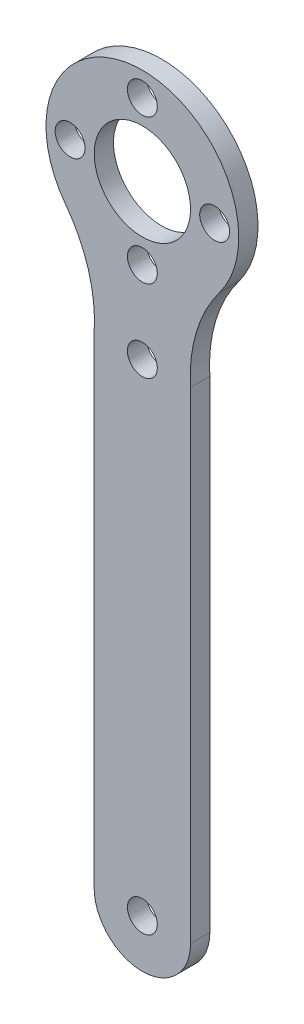
ISO-10303-21;
HEADER;
FILE_DESCRIPTION(('STEP AP214'),'2;1');
FILE_NAME('part.step','',(''),(''),'','','');
FILE_SCHEMA(('AUTOMOTIVE_DESIGN { 1 0 10303 214 1 1 1 1 }'));
ENDSEC;
DATA;
#1=APPLICATION_CONTEXT('core data for automotive mechanical design processes');
#2=APPLICATION_PROTOCOL_DEFINITION('international standard','automotive_design',2000,#1);
#3=PRODUCT_CONTEXT('',#1,'mechanical');
#4=PRODUCT('Part','Part','',(#3));
#5=PRODUCT_RELATED_PRODUCT_CATEGORY('part','',(#4));
#6=PRODUCT_DEFINITION_FORMATION('','',#4);
#7=PRODUCT_DEFINITION_CONTEXT('part definition',#1,'design');
#8=PRODUCT_DEFINITION('design','',#6,#7);
#9=PRODUCT_DEFINITION_SHAPE('','',#8);
#10=(LENGTH_UNIT() NAMED_UNIT(*) SI_UNIT(.MILLI.,.METRE.));
#11=(NAMED_UNIT(*) PLANE_ANGLE_UNIT() SI_UNIT($,.RADIAN.));
#12=(NAMED_UNIT(*) SI_UNIT($,.STERADIAN.) SOLID_ANGLE_UNIT());
#13=UNCERTAINTY_MEASURE_WITH_UNIT(LENGTH_MEASURE(1.E-05),#10,'distance_accuracy_value','');
#14=(GEOMETRIC_REPRESENTATION_CONTEXT(3) GLOBAL_UNCERTAINTY_ASSIGNED_CONTEXT((#13)) GLOBAL_UNIT_ASSIGNED_CONTEXT((#10,
#11,#12)) REPRESENTATION_CONTEXT('',''));
#15=CARTESIAN_POINT('',(0.,0.,0.));
#16=DIRECTION('',(0.,0.,1.));
#17=DIRECTION('',(1.,0.,0.));
#18=AXIS2_PLACEMENT_3D('',#15,#16,#17);
#19=CARTESIAN_POINT('',(0.,41.,2.));
#20=DIRECTION('',(0.,0.,-1.));
#21=DIRECTION('',(-1.,0.,0.));
#22=AXIS2_PLACEMENT_3D('',#19,#20,#21);
#23=CYLINDRICAL_SURFACE('',#22,10.);
#24=CARTESIAN_POINT('',(0.,41.,0.));
#25=DIRECTION('',(0.,0.,1.));
#26=DIRECTION('',(1.,0.,0.));
#27=AXIS2_PLACEMENT_3D('',#24,#25,#26);
#28=CIRCLE('',#27,10.);
#29=CARTESIAN_POINT('',(7.98772100593223,34.9836628143538,0.));
#30=VERTEX_POINT('',#29);
#31=CARTESIAN_POINT('',(-7.98772100593224,34.9836628143538,0.));
#32=VERTEX_POINT('',#31);
#33=EDGE_CURVE('E158',#30,#32,#28,.T.);
#34=ORIENTED_EDGE('',*,*,#33,.T.);
#35=DIRECTION('',(0.,0.,-1.));
#36=VECTOR('',#35,1.);
#37=CARTESIAN_POINT('',(-7.98772100593224,34.9836628143538,2.));
#38=LINE('',#37,#36);
#39=CARTESIAN_POINT('',(-7.98772100593224,34.9836628143538,2.));
#40=VERTEX_POINT('',#39);
#41=EDGE_CURVE('E11',#40,#32,#38,.T.);
#42=ORIENTED_EDGE('',*,*,#41,.F.);
#43=CARTESIAN_POINT('',(0.,41.,2.));
#44=DIRECTION('',(0.,0.,1.));
#45=DIRECTION('',(1.,0.,0.));
#46=AXIS2_PLACEMENT_3D('',#43,#44,#45);
#47=CIRCLE('',#46,10.);
#48=CARTESIAN_POINT('',(7.98772100593223,34.9836628143538,2.));
#49=VERTEX_POINT('',#48);
#50=EDGE_CURVE('E93',#49,#40,#47,.T.);
#51=ORIENTED_EDGE('',*,*,#50,.F.);
#52=DIRECTION('',(0.,0.,-1.));
#53=VECTOR('',#52,1.);
#54=CARTESIAN_POINT('',(7.98772100593223,34.9836628143538,2.));
#55=LINE('',#54,#53);
#56=EDGE_CURVE('E137',#49,#30,#55,.T.);
#57=ORIENTED_EDGE('',*,*,#56,.T.);
#58=EDGE_LOOP('',(#34,#42,#51,#57));
#59=FACE_BOUND('',#58,.T.);
#60=ADVANCED_FACE('F41',(#59),#23,.T.);
#61=CARTESIAN_POINT('',(-19.9693025148306,25.9591570358846,2.));
#62=DIRECTION('',(0.,0.,-1.));
#63=DIRECTION('',(-1.,0.,0.));
#64=AXIS2_PLACEMENT_3D('',#61,#62,#63);
#65=CYLINDRICAL_SURFACE('',#64,15.);
#66=CARTESIAN_POINT('',(-19.9693025148306,25.9591570358846,0.));
#67=DIRECTION('',(0.,0.,1.));
#68=DIRECTION('',(1.,0.,0.));
#69=AXIS2_PLACEMENT_3D('',#66,#67,#68);
#70=CIRCLE('',#69,15.);
#71=CARTESIAN_POINT('',(-5.00000000000001,25.,0.));
#72=VERTEX_POINT('',#71);
#73=EDGE_CURVE('E162',#72,#32,#70,.T.);
#74=ORIENTED_EDGE('',*,*,#73,.F.);
#75=DIRECTION('',(0.,0.,-1.));
#76=VECTOR('',#75,1.);
#77=CARTESIAN_POINT('',(-5.00000000000001,25.,2.));
#78=LINE('',#77,#76);
#79=CARTESIAN_POINT('',(-5.00000000000001,25.,2.));
#80=VERTEX_POINT('',#79);
#81=EDGE_CURVE('E51',#80,#72,#78,.T.);
#82=ORIENTED_EDGE('',*,*,#81,.F.);
#83=CARTESIAN_POINT('',(-19.9693025148306,25.9591570358846,2.));
#84=DIRECTION('',(0.,0.,1.));
#85=DIRECTION('',(1.,0.,0.));
#86=AXIS2_PLACEMENT_3D('',#83,#84,#85);
#87=CIRCLE('',#86,15.);
#88=EDGE_CURVE('E396',#80,#40,#87,.T.);
#89=ORIENTED_EDGE('',*,*,#88,.T.);
#90=ORIENTED_EDGE('',*,*,#41,.T.);
#91=EDGE_LOOP('',(#74,#82,#89,#90));
#92=FACE_BOUND('',#91,.T.);
#93=ADVANCED_FACE('F197',(#92),#65,.F.);
#94=CARTESIAN_POINT('',(-5.,0.,2.));
#95=DIRECTION('',(-1.,0.,0.));
#96=DIRECTION('',(0.,-1.,0.));
#97=AXIS2_PLACEMENT_3D('',#94,#95,#96);
#98=PLANE('',#97);
#99=DIRECTION('',(0.,1.,0.));
#100=VECTOR('',#99,1.);
#101=CARTESIAN_POINT('',(-5.,0.,0.));
#102=LINE('',#101,#100);
#103=CARTESIAN_POINT('',(-5.,-25.,0.));
#104=VERTEX_POINT('',#103);
#105=EDGE_CURVE('E166',#104,#72,#102,.T.);
#106=ORIENTED_EDGE('',*,*,#105,.F.);
#107=DIRECTION('',(0.,0.,-1.));
#108=VECTOR('',#107,1.);
#109=CARTESIAN_POINT('',(-5.,-25.,2.));
#110=LINE('',#109,#108);
#111=CARTESIAN_POINT('',(-5.,-25.,2.));
#112=VERTEX_POINT('',#111);
#113=EDGE_CURVE('E119',#112,#104,#110,.T.);
#114=ORIENTED_EDGE('',*,*,#113,.F.);
#115=DIRECTION('',(0.,1.,0.));
#116=VECTOR('',#115,1.);
#117=CARTESIAN_POINT('',(-5.,0.,2.));
#118=LINE('',#117,#116);
#119=EDGE_CURVE('E110',#112,#80,#118,.T.);
#120=ORIENTED_EDGE('',*,*,#119,.T.);
#121=ORIENTED_EDGE('',*,*,#81,.T.);
#122=EDGE_LOOP('',(#106,#114,#120,#121));
#123=FACE_BOUND('',#122,.T.);
#124=ADVANCED_FACE('F194',(#123),#98,.T.);
#125=CARTESIAN_POINT('',(0.,-25.,2.));
#126=DIRECTION('',(0.,0.,-1.));
#127=DIRECTION('',(-1.,0.,0.));
#128=AXIS2_PLACEMENT_3D('',#125,#126,#127);
#129=CYLINDRICAL_SURFACE('',#128,5.);
#130=CARTESIAN_POINT('',(0.,-25.,0.));
#131=DIRECTION('',(0.,0.,1.));
#132=DIRECTION('',(1.,0.,0.));
#133=AXIS2_PLACEMENT_3D('',#130,#131,#132);
#134=CIRCLE('',#133,5.);
#135=CARTESIAN_POINT('',(5.,-25.,0.));
#136=VERTEX_POINT('',#135);
#137=EDGE_CURVE('E117',#104,#136,#134,.T.);
#138=ORIENTED_EDGE('',*,*,#137,.T.);
#139=DIRECTION('',(0.,0.,-1.));
#140=VECTOR('',#139,1.);
#141=CARTESIAN_POINT('',(5.,-25.,2.));
#142=LINE('',#141,#140);
#143=CARTESIAN_POINT('',(5.,-25.,2.));
#144=VERTEX_POINT('',#143);
#145=EDGE_CURVE('E114',#144,#136,#142,.T.);
#146=ORIENTED_EDGE('',*,*,#145,.F.);
#147=CARTESIAN_POINT('',(0.,-25.,2.));
#148=DIRECTION('',(0.,0.,1.));
#149=DIRECTION('',(1.,0.,0.));
#150=AXIS2_PLACEMENT_3D('',#147,#148,#149);
#151=CIRCLE('',#150,5.);
#152=EDGE_CURVE('E103',#112,#144,#151,.T.);
#153=ORIENTED_EDGE('',*,*,#152,.F.);
#154=ORIENTED_EDGE('',*,*,#113,.T.);
#155=EDGE_LOOP('',(#138,#146,#153,#154));
#156=FACE_BOUND('',#155,.T.);
#157=ADVANCED_FACE('F115',(#156),#129,.T.);
#158=CARTESIAN_POINT('',(4.99999999999999,0.,2.));
#159=DIRECTION('',(-1.,0.,0.));
#160=DIRECTION('',(0.,-1.,0.));
#161=AXIS2_PLACEMENT_3D('',#158,#159,#160);
#162=PLANE('',#161);
#163=DIRECTION('',(0.,1.,0.));
#164=VECTOR('',#163,1.);
#165=CARTESIAN_POINT('',(4.99999999999999,0.,0.));
#166=LINE('',#165,#164);
#167=CARTESIAN_POINT('',(4.99999999999999,25.,0.));
#168=VERTEX_POINT('',#167);
#169=EDGE_CURVE('E81',#136,#168,#166,.T.);
#170=ORIENTED_EDGE('',*,*,#169,.T.);
#171=DIRECTION('',(0.,0.,-1.));
#172=VECTOR('',#171,1.);
#173=CARTESIAN_POINT('',(4.99999999999999,25.,2.));
#174=LINE('',#173,#172);
#175=CARTESIAN_POINT('',(4.99999999999999,25.,2.));
#176=VERTEX_POINT('',#175);
#177=EDGE_CURVE('E120',#176,#168,#174,.T.);
#178=ORIENTED_EDGE('',*,*,#177,.F.);
#179=DIRECTION('',(0.,1.,0.));
#180=VECTOR('',#179,1.);
#181=CARTESIAN_POINT('',(4.99999999999999,0.,2.));
#182=LINE('',#181,#180);
#183=EDGE_CURVE('E108',#144,#176,#182,.T.);
#184=ORIENTED_EDGE('',*,*,#183,.F.);
#185=ORIENTED_EDGE('',*,*,#145,.T.);
#186=EDGE_LOOP('',(#170,#178,#184,#185));
#187=FACE_BOUND('',#186,.T.);
#188=ADVANCED_FACE('F122',(#187),#162,.F.);
#189=CARTESIAN_POINT('',(0.,-25.,2.));
#190=DIRECTION('',(0.,0.,-1.));
#191=DIRECTION('',(-1.,0.,0.));
#192=AXIS2_PLACEMENT_3D('',#189,#190,#191);
#193=CYLINDRICAL_SURFACE('',#192,1.55);
#194=CARTESIAN_POINT('',(0.,-25.,2.));
#195=DIRECTION('',(0.,0.,1.));
#196=DIRECTION('',(1.,0.,0.));
#197=AXIS2_PLACEMENT_3D('',#194,#195,#196);
#198=CIRCLE('',#197,1.55);
#199=CARTESIAN_POINT('',(1.55000000000001,-25.,2.));
#200=VERTEX_POINT('',#199);
#201=EDGE_CURVE('E126',#200,#200,#198,.T.);
#202=ORIENTED_EDGE('',*,*,#201,.T.);
#203=EDGE_LOOP('',(#202));
#204=FACE_BOUND('',#203,.T.);
#205=CARTESIAN_POINT('',(0.,-25.,0.));
#206=DIRECTION('',(0.,0.,1.));
#207=DIRECTION('',(1.,0.,0.));
#208=AXIS2_PLACEMENT_3D('',#205,#206,#207);
#209=CIRCLE('',#208,1.55);
#210=CARTESIAN_POINT('',(1.55000000000001,-25.,0.));
#211=VERTEX_POINT('',#210);
#212=EDGE_CURVE('E176',#211,#211,#209,.T.);
#213=ORIENTED_EDGE('',*,*,#212,.F.);
#214=EDGE_LOOP('',(#213));
#215=FACE_BOUND('',#214,.T.);
#216=ADVANCED_FACE('F206',(#204,#215),#193,.F.);
#217=CARTESIAN_POINT('',(19.9693025148306,25.9591570358845,2.));
#218=DIRECTION('',(0.,0.,-1.));
#219=DIRECTION('',(-1.,0.,0.));
#220=AXIS2_PLACEMENT_3D('',#217,#218,#219);
#221=CYLINDRICAL_SURFACE('',#220,15.);
#222=CARTESIAN_POINT('',(19.9693025148306,25.9591570358845,0.));
#223=DIRECTION('',(0.,0.,1.));
#224=DIRECTION('',(1.,0.,0.));
#225=AXIS2_PLACEMENT_3D('',#222,#223,#224);
#226=CIRCLE('',#225,15.);
#227=EDGE_CURVE('E87',#168,#30,#226,.F.);
#228=ORIENTED_EDGE('',*,*,#227,.T.);
#229=ORIENTED_EDGE('',*,*,#56,.F.);
#230=CARTESIAN_POINT('',(19.9693025148306,25.9591570358845,2.));
#231=DIRECTION('',(0.,0.,1.));
#232=DIRECTION('',(1.,0.,0.));
#233=AXIS2_PLACEMENT_3D('',#230,#231,#232);
#234=CIRCLE('',#233,15.);
#235=EDGE_CURVE('E59',#176,#49,#234,.F.);
#236=ORIENTED_EDGE('',*,*,#235,.F.);
#237=ORIENTED_EDGE('',*,*,#177,.T.);
#238=EDGE_LOOP('',(#228,#229,#236,#237));
#239=FACE_BOUND('',#238,.T.);
#240=ADVANCED_FACE('F203',(#239),#221,.F.);
#241=CARTESIAN_POINT('',(0.,41.,2.));
#242=DIRECTION('',(0.,0.,-1.));
#243=DIRECTION('',(-1.,0.,0.));
#244=AXIS2_PLACEMENT_3D('',#241,#242,#243);
#245=CYLINDRICAL_SURFACE('',#244,5.);
#246=CARTESIAN_POINT('',(0.,41.,2.));
#247=DIRECTION('',(0.,0.,1.));
#248=DIRECTION('',(1.,0.,0.));
#249=AXIS2_PLACEMENT_3D('',#246,#247,#248);
#250=CIRCLE('',#249,5.);
#251=CARTESIAN_POINT('',(5.,41.,2.));
#252=VERTEX_POINT('',#251);
#253=EDGE_CURVE('E391',#252,#252,#250,.T.);
#254=ORIENTED_EDGE('',*,*,#253,.T.);
#255=EDGE_LOOP('',(#254));
#256=FACE_BOUND('',#255,.T.);
#257=CARTESIAN_POINT('',(0.,41.,0.));
#258=DIRECTION('',(0.,0.,1.));
#259=DIRECTION('',(1.,0.,0.));
#260=AXIS2_PLACEMENT_3D('',#257,#258,#259);
#261=CIRCLE('',#260,5.);
#262=CARTESIAN_POINT('',(5.,41.,0.));
#263=VERTEX_POINT('',#262);
#264=EDGE_CURVE('E154',#263,#263,#261,.T.);
#265=ORIENTED_EDGE('',*,*,#264,.F.);
#266=EDGE_LOOP('',(#265));
#267=FACE_BOUND('',#266,.T.);
#268=ADVANCED_FACE('F205',(#256,#267),#245,.F.);
#269=CARTESIAN_POINT('',(0.,48.5,2.));
#270=DIRECTION('',(0.,0.,-1.));
#271=DIRECTION('',(-1.,0.,0.));
#272=AXIS2_PLACEMENT_3D('',#269,#270,#271);
#273=CYLINDRICAL_SURFACE('',#272,1.55);
#274=CARTESIAN_POINT('',(0.,48.5,2.));
#275=DIRECTION('',(0.,0.,1.));
#276=DIRECTION('',(1.,0.,0.));
#277=AXIS2_PLACEMENT_3D('',#274,#275,#276);
#278=CIRCLE('',#277,1.55);
#279=CARTESIAN_POINT('',(1.55,48.5,2.));
#280=VERTEX_POINT('',#279);
#281=EDGE_CURVE('E388',#280,#280,#278,.T.);
#282=ORIENTED_EDGE('',*,*,#281,.T.);
#283=EDGE_LOOP('',(#282));
#284=FACE_BOUND('',#283,.T.);
#285=CARTESIAN_POINT('',(0.,48.5,0.));
#286=DIRECTION('',(0.,0.,1.));
#287=DIRECTION('',(1.,0.,0.));
#288=AXIS2_PLACEMENT_3D('',#285,#286,#287);
#289=CIRCLE('',#288,1.55);
#290=CARTESIAN_POINT('',(1.55,48.5,0.));
#291=VERTEX_POINT('',#290);
#292=EDGE_CURVE('E150',#291,#291,#289,.T.);
#293=ORIENTED_EDGE('',*,*,#292,.F.);
#294=EDGE_LOOP('',(#293));
#295=FACE_BOUND('',#294,.T.);
#296=ADVANCED_FACE('F212',(#284,#295),#273,.F.);
#297=CARTESIAN_POINT('',(7.5,41.,2.));
#298=DIRECTION('',(0.,0.,-1.));
#299=DIRECTION('',(-1.,0.,0.));
#300=AXIS2_PLACEMENT_3D('',#297,#298,#299);
#301=CYLINDRICAL_SURFACE('',#300,1.55);
#302=CARTESIAN_POINT('',(7.5,41.,2.));
#303=DIRECTION('',(0.,0.,1.));
#304=DIRECTION('',(1.,0.,0.));
#305=AXIS2_PLACEMENT_3D('',#302,#303,#304);
#306=CIRCLE('',#305,1.55);
#307=CARTESIAN_POINT('',(9.05,41.,2.));
#308=VERTEX_POINT('',#307);
#309=EDGE_CURVE('E384',#308,#308,#306,.T.);
#310=ORIENTED_EDGE('',*,*,#309,.T.);
#311=EDGE_LOOP('',(#310));
#312=FACE_BOUND('',#311,.T.);
#313=CARTESIAN_POINT('',(7.5,41.,0.));
#314=DIRECTION('',(0.,0.,1.));
#315=DIRECTION('',(1.,0.,0.));
#316=AXIS2_PLACEMENT_3D('',#313,#314,#315);
#317=CIRCLE('',#316,1.55);
#318=CARTESIAN_POINT('',(9.05,41.,0.));
#319=VERTEX_POINT('',#318);
#320=EDGE_CURVE('E146',#319,#319,#317,.T.);
#321=ORIENTED_EDGE('',*,*,#320,.F.);
#322=EDGE_LOOP('',(#321));
#323=FACE_BOUND('',#322,.T.);
#324=ADVANCED_FACE('F228',(#312,#323),#301,.F.);
#325=CARTESIAN_POINT('',(0.,33.5,2.));
#326=DIRECTION('',(0.,0.,-1.));
#327=DIRECTION('',(-1.,0.,0.));
#328=AXIS2_PLACEMENT_3D('',#325,#326,#327);
#329=CYLINDRICAL_SURFACE('',#328,1.55);
#330=CARTESIAN_POINT('',(0.,33.5,2.));
#331=DIRECTION('',(0.,0.,1.));
#332=DIRECTION('',(1.,0.,0.));
#333=AXIS2_PLACEMENT_3D('',#330,#331,#332);
#334=CIRCLE('',#333,1.55);
#335=CARTESIAN_POINT('',(1.55,33.5,2.));
#336=VERTEX_POINT('',#335);
#337=EDGE_CURVE('E243',#336,#336,#334,.T.);
#338=ORIENTED_EDGE('',*,*,#337,.T.);
#339=EDGE_LOOP('',(#338));
#340=FACE_BOUND('',#339,.T.);
#341=CARTESIAN_POINT('',(0.,33.5,0.));
#342=DIRECTION('',(0.,0.,1.));
#343=DIRECTION('',(1.,0.,0.));
#344=AXIS2_PLACEMENT_3D('',#341,#342,#343);
#345=CIRCLE('',#344,1.55);
#346=CARTESIAN_POINT('',(1.55,33.5,0.));
#347=VERTEX_POINT('',#346);
#348=EDGE_CURVE('E142',#347,#347,#345,.T.);
#349=ORIENTED_EDGE('',*,*,#348,.F.);
#350=EDGE_LOOP('',(#349));
#351=FACE_BOUND('',#350,.T.);
#352=ADVANCED_FACE('F231',(#340,#351),#329,.F.);
#353=CARTESIAN_POINT('',(-7.5,41.,2.));
#354=DIRECTION('',(0.,0.,-1.));
#355=DIRECTION('',(-1.,0.,0.));
#356=AXIS2_PLACEMENT_3D('',#353,#354,#355);
#357=CYLINDRICAL_SURFACE('',#356,1.55);
#358=CARTESIAN_POINT('',(-7.5,41.,2.));
#359=DIRECTION('',(0.,0.,1.));
#360=DIRECTION('',(1.,0.,0.));
#361=AXIS2_PLACEMENT_3D('',#358,#359,#360);
#362=CIRCLE('',#361,1.55);
#363=CARTESIAN_POINT('',(-5.95,41.,2.));
#364=VERTEX_POINT('',#363);
#365=EDGE_CURVE('E184',#364,#364,#362,.T.);
#366=ORIENTED_EDGE('',*,*,#365,.T.);
#367=EDGE_LOOP('',(#366));
#368=FACE_BOUND('',#367,.T.);
#369=CARTESIAN_POINT('',(-7.5,41.,0.));
#370=DIRECTION('',(0.,0.,1.));
#371=DIRECTION('',(1.,0.,0.));
#372=AXIS2_PLACEMENT_3D('',#369,#370,#371);
#373=CIRCLE('',#372,1.55);
#374=CARTESIAN_POINT('',(-5.95,41.,0.));
#375=VERTEX_POINT('',#374);
#376=EDGE_CURVE('E138',#375,#375,#373,.T.);
#377=ORIENTED_EDGE('',*,*,#376,.F.);
#378=EDGE_LOOP('',(#377));
#379=FACE_BOUND('',#378,.T.);
#380=ADVANCED_FACE('F43',(#368,#379),#357,.F.);
#381=CARTESIAN_POINT('',(0.,25.,2.));
#382=DIRECTION('',(0.,0.,-1.));
#383=DIRECTION('',(-1.,0.,0.));
#384=AXIS2_PLACEMENT_3D('',#381,#382,#383);
#385=CYLINDRICAL_SURFACE('',#384,1.55);
#386=CARTESIAN_POINT('',(0.,25.,2.));
#387=DIRECTION('',(0.,0.,1.));
#388=DIRECTION('',(1.,0.,0.));
#389=AXIS2_PLACEMENT_3D('',#386,#387,#388);
#390=CIRCLE('',#389,1.55);
#391=CARTESIAN_POINT('',(1.55,25.,2.));
#392=VERTEX_POINT('',#391);
#393=EDGE_CURVE('E133',#392,#392,#390,.T.);
#394=ORIENTED_EDGE('',*,*,#393,.T.);
#395=EDGE_LOOP('',(#394));
#396=FACE_BOUND('',#395,.T.);
#397=CARTESIAN_POINT('',(0.,25.,0.));
#398=DIRECTION('',(0.,0.,1.));
#399=DIRECTION('',(1.,0.,0.));
#400=AXIS2_PLACEMENT_3D('',#397,#398,#399);
#401=CIRCLE('',#400,1.55);
#402=CARTESIAN_POINT('',(1.55,25.,0.));
#403=VERTEX_POINT('',#402);
#404=EDGE_CURVE('E180',#403,#403,#401,.T.);
#405=ORIENTED_EDGE('',*,*,#404,.F.);
#406=EDGE_LOOP('',(#405));
#407=FACE_BOUND('',#406,.T.);
#408=ADVANCED_FACE('F238',(#396,#407),#385,.F.);
#409=CARTESIAN_POINT('',(0.,0.,2.));
#410=DIRECTION('',(0.,0.,1.));
#411=DIRECTION('',(1.,0.,0.));
#412=AXIS2_PLACEMENT_3D('',#409,#410,#411);
#413=PLANE('',#412);
#414=ORIENTED_EDGE('',*,*,#365,.F.);
#415=EDGE_LOOP('',(#414));
#416=FACE_BOUND('',#415,.T.);
#417=ORIENTED_EDGE('',*,*,#337,.F.);
#418=EDGE_LOOP('',(#417));
#419=FACE_BOUND('',#418,.T.);
#420=ORIENTED_EDGE('',*,*,#309,.F.);
#421=EDGE_LOOP('',(#420));
#422=FACE_BOUND('',#421,.T.);
#423=ORIENTED_EDGE('',*,*,#281,.F.);
#424=EDGE_LOOP('',(#423));
#425=FACE_BOUND('',#424,.T.);
#426=ORIENTED_EDGE('',*,*,#253,.F.);
#427=EDGE_LOOP('',(#426));
#428=FACE_BOUND('',#427,.T.);
#429=ORIENTED_EDGE('',*,*,#50,.T.);
#430=ORIENTED_EDGE('',*,*,#88,.F.);
#431=ORIENTED_EDGE('',*,*,#119,.F.);
#432=ORIENTED_EDGE('',*,*,#152,.T.);
#433=ORIENTED_EDGE('',*,*,#183,.T.);
#434=ORIENTED_EDGE('',*,*,#235,.T.);
#435=EDGE_LOOP('',(#429,#430,#431,#432,#433,#434));
#436=FACE_BOUND('',#435,.T.);
#437=ORIENTED_EDGE('',*,*,#201,.F.);
#438=EDGE_LOOP('',(#437));
#439=FACE_BOUND('',#438,.T.);
#440=ORIENTED_EDGE('',*,*,#393,.F.);
#441=EDGE_LOOP('',(#440));
#442=FACE_BOUND('',#441,.T.);
#443=ADVANCED_FACE('F105',(#416,#419,#422,#425,#428,#436,#439,#442),#413,.T.);
#444=CARTESIAN_POINT('',(0.,0.,0.));
#445=DIRECTION('',(0.,0.,1.));
#446=DIRECTION('',(1.,0.,0.));
#447=AXIS2_PLACEMENT_3D('',#444,#445,#446);
#448=PLANE('',#447);
#449=ORIENTED_EDGE('',*,*,#376,.T.);
#450=EDGE_LOOP('',(#449));
#451=FACE_BOUND('',#450,.T.);
#452=ORIENTED_EDGE('',*,*,#348,.T.);
#453=EDGE_LOOP('',(#452));
#454=FACE_BOUND('',#453,.T.);
#455=ORIENTED_EDGE('',*,*,#320,.T.);
#456=EDGE_LOOP('',(#455));
#457=FACE_BOUND('',#456,.T.);
#458=ORIENTED_EDGE('',*,*,#292,.T.);
#459=EDGE_LOOP('',(#458));
#460=FACE_BOUND('',#459,.T.);
#461=ORIENTED_EDGE('',*,*,#264,.T.);
#462=EDGE_LOOP('',(#461));
#463=FACE_BOUND('',#462,.T.);
#464=ORIENTED_EDGE('',*,*,#33,.F.);
#465=ORIENTED_EDGE('',*,*,#227,.F.);
#466=ORIENTED_EDGE('',*,*,#169,.F.);
#467=ORIENTED_EDGE('',*,*,#137,.F.);
#468=ORIENTED_EDGE('',*,*,#105,.T.);
#469=ORIENTED_EDGE('',*,*,#73,.T.);
#470=EDGE_LOOP('',(#464,#465,#466,#467,#468,#469));
#471=FACE_BOUND('',#470,.T.);
#472=ORIENTED_EDGE('',*,*,#212,.T.);
#473=EDGE_LOOP('',(#472));
#474=FACE_BOUND('',#473,.T.);
#475=ORIENTED_EDGE('',*,*,#404,.T.);
#476=EDGE_LOOP('',(#475));
#477=FACE_BOUND('',#476,.T.);
#478=ADVANCED_FACE('F200',(#451,#454,#457,#460,#463,#471,#474,#477),#448,.F.);
#479=CLOSED_SHELL('',(#60,#93,#124,#157,#188,#216,#240,#268,#296,#324,#352,#380,#408,#443,#478));
#480=MANIFOLD_SOLID_BREP('B2',#479);
#481=ADVANCED_BREP_SHAPE_REPRESENTATION('',(#18,#480),#14);
#482=SHAPE_DEFINITION_REPRESENTATION(#9,#481);
ENDSEC;
END-ISO-10303-21;
